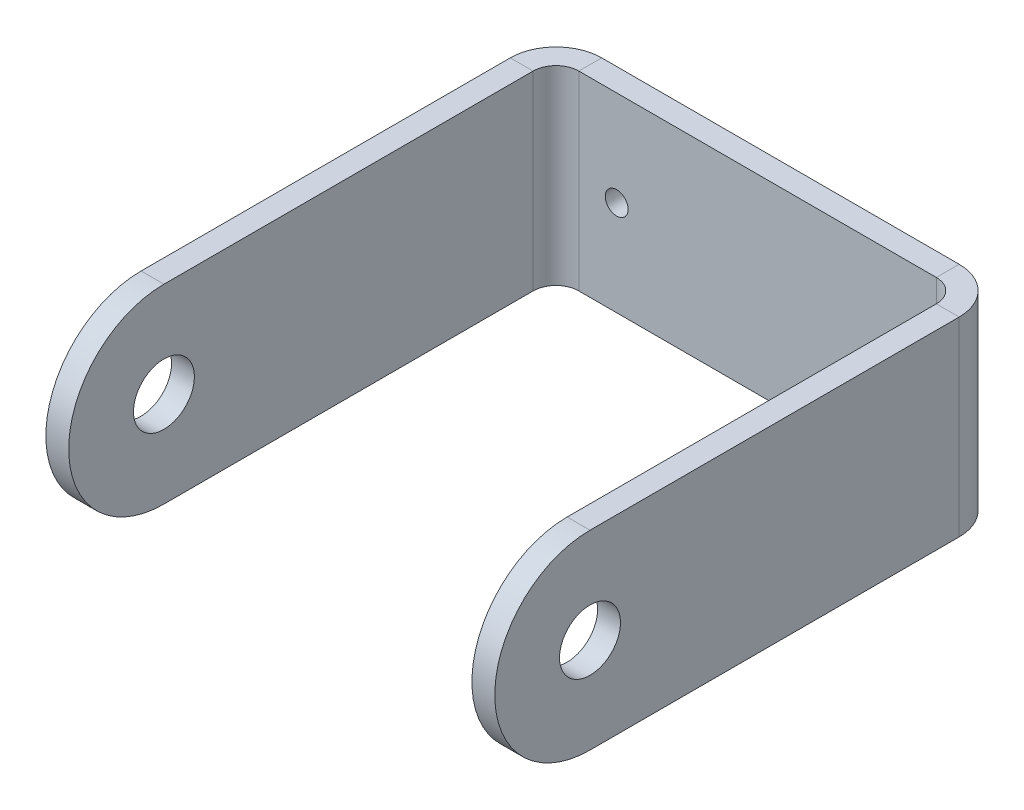
ISO-10303-21;
HEADER;
FILE_DESCRIPTION(('STEP AP214'),'2;1');
FILE_NAME('part.step','',(''),(''),'','','');
FILE_SCHEMA(('AUTOMOTIVE_DESIGN { 1 0 10303 214 1 1 1 1 }'));
ENDSEC;
DATA;
#1=APPLICATION_CONTEXT('core data for automotive mechanical design processes');
#2=APPLICATION_PROTOCOL_DEFINITION('international standard','automotive_design',2000,#1);
#3=PRODUCT_CONTEXT('',#1,'mechanical');
#4=PRODUCT('Part','Part','',(#3));
#5=PRODUCT_RELATED_PRODUCT_CATEGORY('part','',(#4));
#6=PRODUCT_DEFINITION_FORMATION('','',#4);
#7=PRODUCT_DEFINITION_CONTEXT('part definition',#1,'design');
#8=PRODUCT_DEFINITION('design','',#6,#7);
#9=PRODUCT_DEFINITION_SHAPE('','',#8);
#10=(LENGTH_UNIT() NAMED_UNIT(*) SI_UNIT(.MILLI.,.METRE.));
#11=(NAMED_UNIT(*) PLANE_ANGLE_UNIT() SI_UNIT($,.RADIAN.));
#12=(NAMED_UNIT(*) SI_UNIT($,.STERADIAN.) SOLID_ANGLE_UNIT());
#13=UNCERTAINTY_MEASURE_WITH_UNIT(LENGTH_MEASURE(1.E-05),#10,'distance_accuracy_value','');
#14=(GEOMETRIC_REPRESENTATION_CONTEXT(3) GLOBAL_UNCERTAINTY_ASSIGNED_CONTEXT((#13)) GLOBAL_UNIT_ASSIGNED_CONTEXT((#10,
#11,#12)) REPRESENTATION_CONTEXT('',''));
#15=CARTESIAN_POINT('',(0.,0.,0.));
#16=DIRECTION('',(0.,0.,1.));
#17=DIRECTION('',(1.,0.,0.));
#18=AXIS2_PLACEMENT_3D('',#15,#16,#17);
#19=CARTESIAN_POINT('',(79.,0.,3.));
#20=DIRECTION('',(0.,0.,-1.));
#21=DIRECTION('',(-1.,0.,0.));
#22=AXIS2_PLACEMENT_3D('',#19,#20,#21);
#23=PLANE('',#22);
#24=CARTESIAN_POINT('',(-18.5,0.,3.));
#25=DIRECTION('',(0.,0.,-1.));
#26=DIRECTION('',(1.,0.,0.));
#27=AXIS2_PLACEMENT_3D('',#24,#25,#26);
#28=CIRCLE('',#27,1.5);
#29=CARTESIAN_POINT('',(-17.,0.,3.));
#30=VERTEX_POINT('',#29);
#31=EDGE_CURVE('E637',#30,#30,#28,.T.);
#32=ORIENTED_EDGE('',*,*,#31,.T.);
#33=EDGE_LOOP('',(#32));
#34=FACE_BOUND('',#33,.T.);
#35=CARTESIAN_POINT('',(18.5,0.,3.));
#36=DIRECTION('',(0.,0.,-1.));
#37=DIRECTION('',(-1.,0.,0.));
#38=AXIS2_PLACEMENT_3D('',#35,#36,#37);
#39=CIRCLE('',#38,1.5);
#40=CARTESIAN_POINT('',(17.,0.,3.));
#41=VERTEX_POINT('',#40);
#42=EDGE_CURVE('E189',#41,#41,#39,.T.);
#43=ORIENTED_EDGE('',*,*,#42,.T.);
#44=EDGE_LOOP('',(#43));
#45=FACE_BOUND('',#44,.T.);
#46=DIRECTION('',(-1.,0.,0.));
#47=VECTOR('',#46,1.);
#48=CARTESIAN_POINT('',(-79.,12.5,3.));
#49=LINE('',#48,#47);
#50=CARTESIAN_POINT('',(23.4657082647115,12.5,3.));
#51=VERTEX_POINT('',#50);
#52=CARTESIAN_POINT('',(-23.4657082647115,12.5,3.));
#53=VERTEX_POINT('',#52);
#54=EDGE_CURVE('E49',#51,#53,#49,.T.);
#55=ORIENTED_EDGE('',*,*,#54,.T.);
#56=DIRECTION('',(0.,-1.,0.));
#57=VECTOR('',#56,1.);
#58=CARTESIAN_POINT('',(-23.4657082647115,-7.10998678437543E-13,3.));
#59=LINE('',#58,#57);
#60=CARTESIAN_POINT('',(-23.4657082647114,-12.5,3.));
#61=VERTEX_POINT('',#60);
#62=EDGE_CURVE('E259',#53,#61,#59,.T.);
#63=ORIENTED_EDGE('',*,*,#62,.T.);
#64=DIRECTION('',(1.,0.,0.));
#65=VECTOR('',#64,1.);
#66=CARTESIAN_POINT('',(-79.,-12.5,3.));
#67=LINE('',#66,#65);
#68=CARTESIAN_POINT('',(23.4657082647115,-12.5,3.));
#69=VERTEX_POINT('',#68);
#70=EDGE_CURVE('E252',#61,#69,#67,.T.);
#71=ORIENTED_EDGE('',*,*,#70,.T.);
#72=DIRECTION('',(0.,-1.,0.));
#73=VECTOR('',#72,1.);
#74=CARTESIAN_POINT('',(23.4657082647115,0.,3.));
#75=LINE('',#74,#73);
#76=EDGE_CURVE('E249',#51,#69,#75,.T.);
#77=ORIENTED_EDGE('',*,*,#76,.F.);
#78=EDGE_LOOP('',(#55,#63,#71,#77));
#79=FACE_BOUND('',#78,.T.);
#80=ADVANCED_FACE('F45',(#34,#45,#79),#23,.F.);
#81=CARTESIAN_POINT('',(-79.,-12.5,3.));
#82=DIRECTION('',(0.,1.,0.));
#83=DIRECTION('',(1.,0.,0.));
#84=AXIS2_PLACEMENT_3D('',#81,#82,#83);
#85=PLANE('',#84);
#86=DIRECTION('',(0.,0.,1.));
#87=VECTOR('',#86,1.);
#88=CARTESIAN_POINT('',(-23.4657082647114,-12.5,3.));
#89=LINE('',#88,#87);
#90=CARTESIAN_POINT('',(-23.4657082647115,-12.5,0.));
#91=VERTEX_POINT('',#90);
#92=EDGE_CURVE('E12',#91,#61,#89,.T.);
#93=ORIENTED_EDGE('',*,*,#92,.F.);
#94=DIRECTION('',(-1.,0.,0.));
#95=VECTOR('',#94,1.);
#96=CARTESIAN_POINT('',(79.,-12.5,0.));
#97=LINE('',#96,#95);
#98=CARTESIAN_POINT('',(23.4657082647115,-12.5,0.));
#99=VERTEX_POINT('',#98);
#100=EDGE_CURVE('E62',#91,#99,#97,.F.);
#101=ORIENTED_EDGE('',*,*,#100,.T.);
#102=DIRECTION('',(0.,0.,1.));
#103=VECTOR('',#102,1.);
#104=CARTESIAN_POINT('',(23.4657082647115,-12.5,3.));
#105=LINE('',#104,#103);
#106=EDGE_CURVE('E251',#99,#69,#105,.T.);
#107=ORIENTED_EDGE('',*,*,#106,.T.);
#108=ORIENTED_EDGE('',*,*,#70,.F.);
#109=EDGE_LOOP('',(#93,#101,#107,#108));
#110=FACE_BOUND('',#109,.T.);
#111=ADVANCED_FACE('F47',(#110),#85,.F.);
#112=CARTESIAN_POINT('',(-79.,12.5,3.));
#113=DIRECTION('',(0.,-1.,0.));
#114=DIRECTION('',(-1.,0.,0.));
#115=AXIS2_PLACEMENT_3D('',#112,#113,#114);
#116=PLANE('',#115);
#117=DIRECTION('',(0.,0.,-1.));
#118=VECTOR('',#117,1.);
#119=CARTESIAN_POINT('',(-23.4657082647116,12.5,3.));
#120=LINE('',#119,#118);
#121=CARTESIAN_POINT('',(-23.4657082647115,12.5,0.));
#122=VERTEX_POINT('',#121);
#123=EDGE_CURVE('E262',#53,#122,#120,.T.);
#124=ORIENTED_EDGE('',*,*,#123,.F.);
#125=ORIENTED_EDGE('',*,*,#54,.F.);
#126=DIRECTION('',(0.,0.,-1.));
#127=VECTOR('',#126,1.);
#128=CARTESIAN_POINT('',(23.4657082647115,12.5,3.));
#129=LINE('',#128,#127);
#130=CARTESIAN_POINT('',(23.4657082647115,12.5,0.));
#131=VERTEX_POINT('',#130);
#132=EDGE_CURVE('E257',#51,#131,#129,.T.);
#133=ORIENTED_EDGE('',*,*,#132,.T.);
#134=DIRECTION('',(-1.,0.,0.));
#135=VECTOR('',#134,1.);
#136=CARTESIAN_POINT('',(79.,12.5,0.));
#137=LINE('',#136,#135);
#138=EDGE_CURVE('E70',#131,#122,#137,.T.);
#139=ORIENTED_EDGE('',*,*,#138,.T.);
#140=EDGE_LOOP('',(#124,#125,#133,#139));
#141=FACE_BOUND('',#140,.T.);
#142=ADVANCED_FACE('F274',(#141),#116,.F.);
#143=CARTESIAN_POINT('',(79.,0.,0.));
#144=DIRECTION('',(0.,0.,-1.));
#145=DIRECTION('',(-1.,0.,0.));
#146=AXIS2_PLACEMENT_3D('',#143,#144,#145);
#147=PLANE('',#146);
#148=CARTESIAN_POINT('',(-18.5,0.,0.));
#149=DIRECTION('',(0.,0.,-1.));
#150=DIRECTION('',(1.,0.,0.));
#151=AXIS2_PLACEMENT_3D('',#148,#149,#150);
#152=CIRCLE('',#151,1.5);
#153=CARTESIAN_POINT('',(-17.,0.,0.));
#154=VERTEX_POINT('',#153);
#155=EDGE_CURVE('E350',#154,#154,#152,.T.);
#156=ORIENTED_EDGE('',*,*,#155,.F.);
#157=EDGE_LOOP('',(#156));
#158=FACE_BOUND('',#157,.T.);
#159=CARTESIAN_POINT('',(18.5,0.,0.));
#160=DIRECTION('',(0.,0.,-1.));
#161=DIRECTION('',(-1.,0.,0.));
#162=AXIS2_PLACEMENT_3D('',#159,#160,#161);
#163=CIRCLE('',#162,1.5);
#164=CARTESIAN_POINT('',(17.,0.,0.));
#165=VERTEX_POINT('',#164);
#166=EDGE_CURVE('E353',#165,#165,#163,.T.);
#167=ORIENTED_EDGE('',*,*,#166,.F.);
#168=EDGE_LOOP('',(#167));
#169=FACE_BOUND('',#168,.T.);
#170=DIRECTION('',(0.,-1.,0.));
#171=VECTOR('',#170,1.);
#172=CARTESIAN_POINT('',(-23.4657082647115,-7.10998678437543E-13,0.));
#173=LINE('',#172,#171);
#174=EDGE_CURVE('E54',#122,#91,#173,.T.);
#175=ORIENTED_EDGE('',*,*,#174,.F.);
#176=ORIENTED_EDGE('',*,*,#138,.F.);
#177=DIRECTION('',(0.,-1.,0.));
#178=VECTOR('',#177,1.);
#179=CARTESIAN_POINT('',(23.4657082647115,0.,0.));
#180=LINE('',#179,#178);
#181=EDGE_CURVE('E255',#131,#99,#180,.T.);
#182=ORIENTED_EDGE('',*,*,#181,.T.);
#183=ORIENTED_EDGE('',*,*,#100,.F.);
#184=EDGE_LOOP('',(#175,#176,#182,#183));
#185=FACE_BOUND('',#184,.T.);
#186=ADVANCED_FACE('F341',(#158,#169,#185),#147,.T.);
#187=CARTESIAN_POINT('',(23.4657082647115,12.5,6.));
#188=DIRECTION('',(0.,-1.,0.));
#189=DIRECTION('',(0.,0.,-1.));
#190=AXIS2_PLACEMENT_3D('',#187,#188,#189);
#191=PLANE('',#190);
#192=DIRECTION('',(1.,0.,0.));
#193=VECTOR('',#192,1.);
#194=CARTESIAN_POINT('',(26.4657082647115,12.5,6.00000000000001));
#195=LINE('',#194,#193);
#196=CARTESIAN_POINT('',(26.4657082647115,12.5,6.00000000000001));
#197=VERTEX_POINT('',#196);
#198=CARTESIAN_POINT('',(29.4657082647115,12.5,6.00000000000002));
#199=VERTEX_POINT('',#198);
#200=EDGE_CURVE('E197',#197,#199,#195,.T.);
#201=ORIENTED_EDGE('',*,*,#200,.T.);
#202=CARTESIAN_POINT('',(23.4657082647115,12.5,6.));
#203=DIRECTION('',(0.,1.,0.));
#204=DIRECTION('',(-1.,0.,0.));
#205=AXIS2_PLACEMENT_3D('',#202,#203,#204);
#206=CIRCLE('',#205,6.);
#207=EDGE_CURVE('E204',#199,#131,#206,.T.);
#208=ORIENTED_EDGE('',*,*,#207,.T.);
#209=ORIENTED_EDGE('',*,*,#132,.F.);
#210=CARTESIAN_POINT('',(23.4657082647115,12.5,6.));
#211=DIRECTION('',(0.,1.,0.));
#212=DIRECTION('',(0.,0.,1.));
#213=AXIS2_PLACEMENT_3D('',#210,#211,#212);
#214=CIRCLE('',#213,3.);
#215=EDGE_CURVE('E239',#197,#51,#214,.T.);
#216=ORIENTED_EDGE('',*,*,#215,.F.);
#217=EDGE_LOOP('',(#201,#208,#209,#216));
#218=FACE_BOUND('',#217,.T.);
#219=ADVANCED_FACE('F304',(#218),#191,.F.);
#220=CARTESIAN_POINT('',(23.4657082647115,-12.5,6.));
#221=DIRECTION('',(0.,1.,0.));
#222=DIRECTION('',(0.,0.,1.));
#223=AXIS2_PLACEMENT_3D('',#220,#221,#222);
#224=PLANE('',#223);
#225=ORIENTED_EDGE('',*,*,#106,.F.);
#226=CARTESIAN_POINT('',(23.4657082647115,-12.5,6.));
#227=DIRECTION('',(0.,1.,0.));
#228=DIRECTION('',(-1.,0.,0.));
#229=AXIS2_PLACEMENT_3D('',#226,#227,#228);
#230=CIRCLE('',#229,6.);
#231=CARTESIAN_POINT('',(29.4657082647115,-12.5,6.00000000000002));
#232=VERTEX_POINT('',#231);
#233=EDGE_CURVE('E243',#99,#232,#230,.F.);
#234=ORIENTED_EDGE('',*,*,#233,.T.);
#235=DIRECTION('',(-1.,0.,0.));
#236=VECTOR('',#235,1.);
#237=CARTESIAN_POINT('',(26.4657082647115,-12.5,6.00000000000001));
#238=LINE('',#237,#236);
#239=CARTESIAN_POINT('',(26.4657082647115,-12.5,6.));
#240=VERTEX_POINT('',#239);
#241=EDGE_CURVE('E231',#232,#240,#238,.T.);
#242=ORIENTED_EDGE('',*,*,#241,.T.);
#243=CARTESIAN_POINT('',(23.4657082647115,-12.5,6.));
#244=DIRECTION('',(0.,-1.,0.));
#245=DIRECTION('',(0.,0.,-1.));
#246=AXIS2_PLACEMENT_3D('',#243,#244,#245);
#247=CIRCLE('',#246,3.);
#248=EDGE_CURVE('E242',#69,#240,#247,.T.);
#249=ORIENTED_EDGE('',*,*,#248,.F.);
#250=EDGE_LOOP('',(#225,#234,#242,#249));
#251=FACE_BOUND('',#250,.T.);
#252=ADVANCED_FACE('F289',(#251),#224,.F.);
#253=CARTESIAN_POINT('',(23.4657082647115,-26.1527220816594,6.));
#254=DIRECTION('',(0.,1.,0.));
#255=DIRECTION('',(-1.,0.,0.));
#256=AXIS2_PLACEMENT_3D('',#253,#254,#255);
#257=CYLINDRICAL_SURFACE('',#256,3.);
#258=ORIENTED_EDGE('',*,*,#248,.T.);
#259=DIRECTION('',(0.,-1.,0.));
#260=VECTOR('',#259,1.);
#261=CARTESIAN_POINT('',(26.4657082647115,0.,6.00000000000001));
#262=LINE('',#261,#260);
#263=EDGE_CURVE('E218',#197,#240,#262,.T.);
#264=ORIENTED_EDGE('',*,*,#263,.F.);
#265=ORIENTED_EDGE('',*,*,#215,.T.);
#266=ORIENTED_EDGE('',*,*,#76,.T.);
#267=EDGE_LOOP('',(#258,#264,#265,#266));
#268=FACE_BOUND('',#267,.T.);
#269=ADVANCED_FACE('F318',(#268),#257,.F.);
#270=CARTESIAN_POINT('',(23.4657082647115,-26.1527220816594,6.));
#271=DIRECTION('',(0.,1.,0.));
#272=DIRECTION('',(-1.,0.,0.));
#273=AXIS2_PLACEMENT_3D('',#270,#271,#272);
#274=CYLINDRICAL_SURFACE('',#273,6.);
#275=ORIENTED_EDGE('',*,*,#233,.F.);
#276=ORIENTED_EDGE('',*,*,#181,.F.);
#277=ORIENTED_EDGE('',*,*,#207,.F.);
#278=DIRECTION('',(0.,-1.,0.));
#279=VECTOR('',#278,1.);
#280=CARTESIAN_POINT('',(29.4657082647115,0.,6.00000000000002));
#281=LINE('',#280,#279);
#282=EDGE_CURVE('E234',#199,#232,#281,.T.);
#283=ORIENTED_EDGE('',*,*,#282,.T.);
#284=EDGE_LOOP('',(#275,#276,#277,#283));
#285=FACE_BOUND('',#284,.T.);
#286=ADVANCED_FACE('F292',(#285),#274,.T.);
#287=CARTESIAN_POINT('',(26.4657082647113,0.,54.4657082647115));
#288=DIRECTION('',(-1.,0.,0.));
#289=DIRECTION('',(0.,0.,1.));
#290=AXIS2_PLACEMENT_3D('',#287,#288,#289);
#291=CYLINDRICAL_SURFACE('',#290,12.5);
#292=DIRECTION('',(-1.,0.,0.));
#293=VECTOR('',#292,1.);
#294=CARTESIAN_POINT('',(26.4657082647113,-12.5,54.4657082647115));
#295=LINE('',#294,#293);
#296=CARTESIAN_POINT('',(29.4657082647113,-12.5,54.4657082647115));
#297=VERTEX_POINT('',#296);
#298=CARTESIAN_POINT('',(26.4657082647113,-12.5,54.4657082647115));
#299=VERTEX_POINT('',#298);
#300=EDGE_CURVE('E208',#297,#299,#295,.T.);
#301=ORIENTED_EDGE('',*,*,#300,.F.);
#302=CARTESIAN_POINT('',(29.4657082647113,0.,54.4657082647115));
#303=DIRECTION('',(-1.,0.,0.));
#304=DIRECTION('',(0.,0.,1.));
#305=AXIS2_PLACEMENT_3D('',#302,#303,#304);
#306=CIRCLE('',#305,12.5);
#307=CARTESIAN_POINT('',(29.4657082647113,12.5,54.4657082647115));
#308=VERTEX_POINT('',#307);
#309=EDGE_CURVE('E228',#297,#308,#306,.T.);
#310=ORIENTED_EDGE('',*,*,#309,.T.);
#311=DIRECTION('',(-1.,0.,0.));
#312=VECTOR('',#311,1.);
#313=CARTESIAN_POINT('',(26.4657082647113,12.5,54.4657082647115));
#314=LINE('',#313,#312);
#315=CARTESIAN_POINT('',(26.4657082647113,12.5,54.4657082647115));
#316=VERTEX_POINT('',#315);
#317=EDGE_CURVE('E226',#308,#316,#314,.T.);
#318=ORIENTED_EDGE('',*,*,#317,.T.);
#319=CARTESIAN_POINT('',(26.4657082647113,0.,54.4657082647115));
#320=DIRECTION('',(-1.,0.,0.));
#321=DIRECTION('',(0.,0.,-1.));
#322=AXIS2_PLACEMENT_3D('',#319,#320,#321);
#323=CIRCLE('',#322,12.5);
#324=EDGE_CURVE('E213',#299,#316,#323,.T.);
#325=ORIENTED_EDGE('',*,*,#324,.F.);
#326=EDGE_LOOP('',(#301,#310,#318,#325));
#327=FACE_BOUND('',#326,.T.);
#328=ADVANCED_FACE('F312',(#327),#291,.T.);
#329=CARTESIAN_POINT('',(26.4657082647113,0.,54.4657082647115));
#330=DIRECTION('',(-1.,0.,0.));
#331=DIRECTION('',(0.,0.,1.));
#332=AXIS2_PLACEMENT_3D('',#329,#330,#331);
#333=CYLINDRICAL_SURFACE('',#332,4.00000000000001);
#334=CARTESIAN_POINT('',(26.4657082647113,0.,54.4657082647115));
#335=DIRECTION('',(-1.,0.,0.));
#336=DIRECTION('',(0.,0.,-1.));
#337=AXIS2_PLACEMENT_3D('',#334,#335,#336);
#338=CIRCLE('',#337,4.00000000000001);
#339=CARTESIAN_POINT('',(26.4657082647113,0.,50.4657082647115));
#340=VERTEX_POINT('',#339);
#341=EDGE_CURVE('E223',#340,#340,#338,.T.);
#342=ORIENTED_EDGE('',*,*,#341,.T.);
#343=EDGE_LOOP('',(#342));
#344=FACE_BOUND('',#343,.T.);
#345=CARTESIAN_POINT('',(29.4657082647113,0.,54.4657082647115));
#346=DIRECTION('',(-1.,0.,0.));
#347=DIRECTION('',(0.,0.,1.));
#348=AXIS2_PLACEMENT_3D('',#345,#346,#347);
#349=CIRCLE('',#348,4.00000000000001);
#350=CARTESIAN_POINT('',(29.4657082647113,0.,58.4657082647115));
#351=VERTEX_POINT('',#350);
#352=EDGE_CURVE('E205',#351,#351,#349,.T.);
#353=ORIENTED_EDGE('',*,*,#352,.F.);
#354=EDGE_LOOP('',(#353));
#355=FACE_BOUND('',#354,.T.);
#356=ADVANCED_FACE('F374',(#344,#355),#333,.F.);
#357=CARTESIAN_POINT('',(26.4657082647113,0.,54.4657082647115));
#358=DIRECTION('',(1.,0.,0.));
#359=DIRECTION('',(0.,0.,-1.));
#360=AXIS2_PLACEMENT_3D('',#357,#358,#359);
#361=PLANE('',#360);
#362=ORIENTED_EDGE('',*,*,#341,.F.);
#363=EDGE_LOOP('',(#362));
#364=FACE_BOUND('',#363,.T.);
#365=DIRECTION('',(0.,0.,-1.));
#366=VECTOR('',#365,1.);
#367=CARTESIAN_POINT('',(26.4657082647119,12.5,-103.534291735289));
#368=LINE('',#367,#366);
#369=EDGE_CURVE('E221',#316,#197,#368,.T.);
#370=ORIENTED_EDGE('',*,*,#369,.T.);
#371=ORIENTED_EDGE('',*,*,#263,.T.);
#372=DIRECTION('',(0.,0.,1.));
#373=VECTOR('',#372,1.);
#374=CARTESIAN_POINT('',(26.4657082647119,-12.5,-103.534291735289));
#375=LINE('',#374,#373);
#376=EDGE_CURVE('E216',#240,#299,#375,.T.);
#377=ORIENTED_EDGE('',*,*,#376,.T.);
#378=ORIENTED_EDGE('',*,*,#324,.T.);
#379=EDGE_LOOP('',(#370,#371,#377,#378));
#380=FACE_BOUND('',#379,.T.);
#381=ADVANCED_FACE('F314',(#364,#380),#361,.F.);
#382=CARTESIAN_POINT('',(26.4657082647119,-12.5,-103.534291735289));
#383=DIRECTION('',(0.,1.,0.));
#384=DIRECTION('',(0.,0.,1.));
#385=AXIS2_PLACEMENT_3D('',#382,#383,#384);
#386=PLANE('',#385);
#387=ORIENTED_EDGE('',*,*,#241,.F.);
#388=DIRECTION('',(0.,0.,-1.));
#389=VECTOR('',#388,1.);
#390=CARTESIAN_POINT('',(29.4657082647113,-12.5,54.4657082647115));
#391=LINE('',#390,#389);
#392=EDGE_CURVE('E211',#232,#297,#391,.F.);
#393=ORIENTED_EDGE('',*,*,#392,.T.);
#394=ORIENTED_EDGE('',*,*,#300,.T.);
#395=ORIENTED_EDGE('',*,*,#376,.F.);
#396=EDGE_LOOP('',(#387,#393,#394,#395));
#397=FACE_BOUND('',#396,.T.);
#398=ADVANCED_FACE('F316',(#397),#386,.F.);
#399=CARTESIAN_POINT('',(29.4657082647113,0.,54.4657082647115));
#400=DIRECTION('',(1.,0.,0.));
#401=DIRECTION('',(0.,0.,-1.));
#402=AXIS2_PLACEMENT_3D('',#399,#400,#401);
#403=PLANE('',#402);
#404=ORIENTED_EDGE('',*,*,#282,.F.);
#405=DIRECTION('',(0.,0.,-1.));
#406=VECTOR('',#405,1.);
#407=CARTESIAN_POINT('',(29.4657082647113,12.5,54.4657082647115));
#408=LINE('',#407,#406);
#409=EDGE_CURVE('E202',#308,#199,#408,.T.);
#410=ORIENTED_EDGE('',*,*,#409,.F.);
#411=ORIENTED_EDGE('',*,*,#309,.F.);
#412=ORIENTED_EDGE('',*,*,#392,.F.);
#413=EDGE_LOOP('',(#404,#410,#411,#412));
#414=FACE_BOUND('',#413,.T.);
#415=ORIENTED_EDGE('',*,*,#352,.T.);
#416=EDGE_LOOP('',(#415));
#417=FACE_BOUND('',#416,.T.);
#418=ADVANCED_FACE('F297',(#414,#417),#403,.T.);
#419=CARTESIAN_POINT('',(26.4657082647119,12.5,-103.534291735289));
#420=DIRECTION('',(0.,-1.,0.));
#421=DIRECTION('',(0.,0.,-1.));
#422=AXIS2_PLACEMENT_3D('',#419,#420,#421);
#423=PLANE('',#422);
#424=ORIENTED_EDGE('',*,*,#200,.F.);
#425=ORIENTED_EDGE('',*,*,#369,.F.);
#426=ORIENTED_EDGE('',*,*,#317,.F.);
#427=ORIENTED_EDGE('',*,*,#409,.T.);
#428=EDGE_LOOP('',(#424,#425,#426,#427));
#429=FACE_BOUND('',#428,.T.);
#430=ADVANCED_FACE('F308',(#429),#423,.F.);
#431=CARTESIAN_POINT('',(-23.4657082647116,12.5,6.));
#432=DIRECTION('',(0.,-1.,0.));
#433=DIRECTION('',(1.,0.,0.));
#434=AXIS2_PLACEMENT_3D('',#431,#432,#433);
#435=PLANE('',#434);
#436=ORIENTED_EDGE('',*,*,#123,.T.);
#437=CARTESIAN_POINT('',(-23.4657082647116,12.5,6.));
#438=DIRECTION('',(0.,-1.,0.));
#439=DIRECTION('',(1.,0.,0.));
#440=AXIS2_PLACEMENT_3D('',#437,#438,#439);
#441=CIRCLE('',#440,6.);
#442=CARTESIAN_POINT('',(-29.4657082647116,12.5,5.99999999999993));
#443=VERTEX_POINT('',#442);
#444=EDGE_CURVE('E166',#122,#443,#441,.F.);
#445=ORIENTED_EDGE('',*,*,#444,.T.);
#446=DIRECTION('',(-1.,0.,0.));
#447=VECTOR('',#446,1.);
#448=CARTESIAN_POINT('',(-26.4657082647117,12.5,5.99999999999993));
#449=LINE('',#448,#447);
#450=CARTESIAN_POINT('',(-26.4657082647117,12.5,5.99999999999984));
#451=VERTEX_POINT('',#450);
#452=EDGE_CURVE('E177',#451,#443,#449,.T.);
#453=ORIENTED_EDGE('',*,*,#452,.F.);
#454=CARTESIAN_POINT('',(-23.4657082647116,12.5,6.));
#455=DIRECTION('',(0.,1.,0.));
#456=DIRECTION('',(-1.,0.,0.));
#457=AXIS2_PLACEMENT_3D('',#454,#455,#456);
#458=CIRCLE('',#457,3.);
#459=EDGE_CURVE('E190',#53,#451,#458,.T.);
#460=ORIENTED_EDGE('',*,*,#459,.F.);
#461=EDGE_LOOP('',(#436,#445,#453,#460));
#462=FACE_BOUND('',#461,.T.);
#463=ADVANCED_FACE('F278',(#462),#435,.F.);
#464=CARTESIAN_POINT('',(-23.4657082647114,-12.5,6.));
#465=DIRECTION('',(0.,1.,0.));
#466=DIRECTION('',(0.,0.,1.));
#467=AXIS2_PLACEMENT_3D('',#464,#465,#466);
#468=PLANE('',#467);
#469=DIRECTION('',(1.,0.,0.));
#470=VECTOR('',#469,1.);
#471=CARTESIAN_POINT('',(-26.4657082647115,-12.5,5.99999999999993));
#472=LINE('',#471,#470);
#473=CARTESIAN_POINT('',(-29.4657082647115,-12.5,5.99999999999994));
#474=VERTEX_POINT('',#473);
#475=CARTESIAN_POINT('',(-26.4657082647114,-12.5,6.));
#476=VERTEX_POINT('',#475);
#477=EDGE_CURVE('E164',#474,#476,#472,.T.);
#478=ORIENTED_EDGE('',*,*,#477,.F.);
#479=CARTESIAN_POINT('',(-23.4657082647114,-12.5,6.));
#480=DIRECTION('',(0.,-1.,0.));
#481=DIRECTION('',(1.,0.,0.));
#482=AXIS2_PLACEMENT_3D('',#479,#480,#481);
#483=CIRCLE('',#482,6.);
#484=EDGE_CURVE('E194',#474,#91,#483,.T.);
#485=ORIENTED_EDGE('',*,*,#484,.T.);
#486=ORIENTED_EDGE('',*,*,#92,.T.);
#487=CARTESIAN_POINT('',(-23.4657082647114,-12.5,6.));
#488=DIRECTION('',(0.,-1.,0.));
#489=DIRECTION('',(0.,0.,-1.));
#490=AXIS2_PLACEMENT_3D('',#487,#488,#489);
#491=CIRCLE('',#490,3.);
#492=EDGE_CURVE('E193',#476,#61,#491,.T.);
#493=ORIENTED_EDGE('',*,*,#492,.F.);
#494=EDGE_LOOP('',(#478,#485,#486,#493));
#495=FACE_BOUND('',#494,.T.);
#496=ADVANCED_FACE('F283',(#495),#468,.F.);
#497=CARTESIAN_POINT('',(-23.4657082647117,26.1527220816594,6.));
#498=DIRECTION('',(0.,-1.,0.));
#499=DIRECTION('',(1.,0.,0.));
#500=AXIS2_PLACEMENT_3D('',#497,#498,#499);
#501=CYLINDRICAL_SURFACE('',#500,3.);
#502=ORIENTED_EDGE('',*,*,#492,.T.);
#503=ORIENTED_EDGE('',*,*,#62,.F.);
#504=ORIENTED_EDGE('',*,*,#459,.T.);
#505=DIRECTION('',(0.,-1.,0.));
#506=VECTOR('',#505,1.);
#507=CARTESIAN_POINT('',(-26.4657082647116,-7.32053306862212E-13,5.99999999999993));
#508=LINE('',#507,#506);
#509=EDGE_CURVE('E186',#451,#476,#508,.T.);
#510=ORIENTED_EDGE('',*,*,#509,.T.);
#511=EDGE_LOOP('',(#502,#503,#504,#510));
#512=FACE_BOUND('',#511,.T.);
#513=ADVANCED_FACE('F280',(#512),#501,.F.);
#514=CARTESIAN_POINT('',(-23.4657082647117,26.1527220816594,6.));
#515=DIRECTION('',(0.,-1.,0.));
#516=DIRECTION('',(1.,0.,0.));
#517=AXIS2_PLACEMENT_3D('',#514,#515,#516);
#518=CYLINDRICAL_SURFACE('',#517,6.);
#519=ORIENTED_EDGE('',*,*,#484,.F.);
#520=DIRECTION('',(0.,-1.,0.));
#521=VECTOR('',#520,1.);
#522=CARTESIAN_POINT('',(-29.4657082647116,-7.52869988573934E-13,5.99999999999994));
#523=LINE('',#522,#521);
#524=EDGE_CURVE('E162',#443,#474,#523,.T.);
#525=ORIENTED_EDGE('',*,*,#524,.F.);
#526=ORIENTED_EDGE('',*,*,#444,.F.);
#527=ORIENTED_EDGE('',*,*,#174,.T.);
#528=EDGE_LOOP('',(#519,#525,#526,#527));
#529=FACE_BOUND('',#528,.T.);
#530=ADVANCED_FACE('F355',(#529),#518,.T.);
#531=CARTESIAN_POINT('',(-26.4657082647114,3.64291929955131E-13,54.4657082647114));
#532=DIRECTION('',(1.,0.,0.));
#533=DIRECTION('',(0.,0.,-1.));
#534=AXIS2_PLACEMENT_3D('',#531,#532,#533);
#535=CYLINDRICAL_SURFACE('',#534,4.00000000000001);
#536=CARTESIAN_POINT('',(-26.4657082647114,3.64291929955131E-13,54.4657082647114));
#537=DIRECTION('',(1.,0.,0.));
#538=DIRECTION('',(0.,0.,-1.));
#539=AXIS2_PLACEMENT_3D('',#536,#537,#538);
#540=CIRCLE('',#539,4.00000000000001);
#541=CARTESIAN_POINT('',(-26.4657082647114,3.36536354339502E-13,50.4657082647114));
#542=VERTEX_POINT('',#541);
#543=EDGE_CURVE('E158',#542,#542,#540,.T.);
#544=ORIENTED_EDGE('',*,*,#543,.T.);
#545=EDGE_LOOP('',(#544));
#546=FACE_BOUND('',#545,.T.);
#547=CARTESIAN_POINT('',(-29.4657082647114,3.4347524824341E-13,54.4657082647114));
#548=DIRECTION('',(1.,0.,0.));
#549=DIRECTION('',(0.,0.,-1.));
#550=AXIS2_PLACEMENT_3D('',#547,#548,#549);
#551=CIRCLE('',#550,4.00000000000001);
#552=CARTESIAN_POINT('',(-29.4657082647114,3.15719672627781E-13,50.4657082647114));
#553=VERTEX_POINT('',#552);
#554=EDGE_CURVE('E168',#553,#553,#551,.T.);
#555=ORIENTED_EDGE('',*,*,#554,.F.);
#556=EDGE_LOOP('',(#555));
#557=FACE_BOUND('',#556,.T.);
#558=ADVANCED_FACE('F357',(#546,#557),#535,.F.);
#559=CARTESIAN_POINT('',(-26.4657082647114,3.64291929955131E-13,54.4657082647114));
#560=DIRECTION('',(1.,0.,0.));
#561=DIRECTION('',(0.,0.,-1.));
#562=AXIS2_PLACEMENT_3D('',#559,#560,#561);
#563=CYLINDRICAL_SURFACE('',#562,12.5);
#564=DIRECTION('',(1.,0.,0.));
#565=VECTOR('',#564,1.);
#566=CARTESIAN_POINT('',(-26.4657082647115,12.5000000000004,54.4657082647113));
#567=LINE('',#566,#565);
#568=CARTESIAN_POINT('',(-29.4657082647115,12.5000000000003,54.4657082647113));
#569=VERTEX_POINT('',#568);
#570=CARTESIAN_POINT('',(-26.4657082647115,12.5000000000004,54.4657082647113));
#571=VERTEX_POINT('',#570);
#572=EDGE_CURVE('E156',#569,#571,#567,.T.);
#573=ORIENTED_EDGE('',*,*,#572,.F.);
#574=CARTESIAN_POINT('',(-29.4657082647114,3.4347524824341E-13,54.4657082647114));
#575=DIRECTION('',(1.,0.,0.));
#576=DIRECTION('',(0.,0.,-1.));
#577=AXIS2_PLACEMENT_3D('',#574,#575,#576);
#578=CIRCLE('',#577,12.5);
#579=CARTESIAN_POINT('',(-29.4657082647113,-12.4999999999997,54.4657082647115));
#580=VERTEX_POINT('',#579);
#581=EDGE_CURVE('E150',#569,#580,#578,.T.);
#582=ORIENTED_EDGE('',*,*,#581,.T.);
#583=DIRECTION('',(1.,0.,0.));
#584=VECTOR('',#583,1.);
#585=CARTESIAN_POINT('',(-26.4657082647113,-12.4999999999996,54.4657082647115));
#586=LINE('',#585,#584);
#587=CARTESIAN_POINT('',(-26.4657082647113,-12.4999999999996,54.4657082647115));
#588=VERTEX_POINT('',#587);
#589=EDGE_CURVE('E138',#580,#588,#586,.T.);
#590=ORIENTED_EDGE('',*,*,#589,.T.);
#591=CARTESIAN_POINT('',(-26.4657082647114,3.64291929955131E-13,54.4657082647114));
#592=DIRECTION('',(1.,0.,0.));
#593=DIRECTION('',(0.,0.,-1.));
#594=AXIS2_PLACEMENT_3D('',#591,#592,#593);
#595=CIRCLE('',#594,12.5);
#596=EDGE_CURVE('E181',#571,#588,#595,.T.);
#597=ORIENTED_EDGE('',*,*,#596,.F.);
#598=EDGE_LOOP('',(#573,#582,#590,#597));
#599=FACE_BOUND('',#598,.T.);
#600=ADVANCED_FACE('F154',(#599),#563,.T.);
#601=CARTESIAN_POINT('',(-26.4657082647119,-7.32053306862215E-13,-103.534291735289));
#602=DIRECTION('',(-1.,0.,0.));
#603=DIRECTION('',(0.,0.,1.));
#604=AXIS2_PLACEMENT_3D('',#601,#602,#603);
#605=PLANE('',#604);
#606=ORIENTED_EDGE('',*,*,#509,.F.);
#607=DIRECTION('',(0.,0.,1.));
#608=VECTOR('',#607,1.);
#609=CARTESIAN_POINT('',(-26.4657082647115,12.5000000000004,54.4657082647113));
#610=LINE('',#609,#608);
#611=EDGE_CURVE('E149',#451,#571,#610,.T.);
#612=ORIENTED_EDGE('',*,*,#611,.T.);
#613=ORIENTED_EDGE('',*,*,#596,.T.);
#614=DIRECTION('',(0.,0.,-1.));
#615=VECTOR('',#614,1.);
#616=CARTESIAN_POINT('',(-26.4657082647113,-12.4999999999996,54.4657082647115));
#617=LINE('',#616,#615);
#618=EDGE_CURVE('E145',#588,#476,#617,.T.);
#619=ORIENTED_EDGE('',*,*,#618,.T.);
#620=EDGE_LOOP('',(#606,#612,#613,#619));
#621=FACE_BOUND('',#620,.T.);
#622=ORIENTED_EDGE('',*,*,#543,.F.);
#623=EDGE_LOOP('',(#622));
#624=FACE_BOUND('',#623,.T.);
#625=ADVANCED_FACE('F425',(#621,#624),#605,.F.);
#626=CARTESIAN_POINT('',(-26.4657082647115,12.5000000000004,54.4657082647113));
#627=DIRECTION('',(0.,-1.,0.));
#628=DIRECTION('',(0.,0.,1.));
#629=AXIS2_PLACEMENT_3D('',#626,#627,#628);
#630=PLANE('',#629);
#631=ORIENTED_EDGE('',*,*,#611,.F.);
#632=ORIENTED_EDGE('',*,*,#452,.T.);
#633=DIRECTION('',(0.,0.,1.));
#634=VECTOR('',#633,1.);
#635=CARTESIAN_POINT('',(-29.465708264712,12.4999999999992,-103.534291735289));
#636=LINE('',#635,#634);
#637=EDGE_CURVE('E175',#443,#569,#636,.T.);
#638=ORIENTED_EDGE('',*,*,#637,.T.);
#639=ORIENTED_EDGE('',*,*,#572,.T.);
#640=EDGE_LOOP('',(#631,#632,#638,#639));
#641=FACE_BOUND('',#640,.T.);
#642=ADVANCED_FACE('F434',(#641),#630,.F.);
#643=CARTESIAN_POINT('',(-29.4657082647119,-7.52869988573936E-13,-103.534291735289));
#644=DIRECTION('',(-1.,0.,0.));
#645=DIRECTION('',(0.,0.,1.));
#646=AXIS2_PLACEMENT_3D('',#643,#644,#645);
#647=PLANE('',#646);
#648=ORIENTED_EDGE('',*,*,#554,.T.);
#649=EDGE_LOOP('',(#648));
#650=FACE_BOUND('',#649,.T.);
#651=ORIENTED_EDGE('',*,*,#637,.F.);
#652=ORIENTED_EDGE('',*,*,#524,.T.);
#653=DIRECTION('',(0.,0.,1.));
#654=VECTOR('',#653,1.);
#655=CARTESIAN_POINT('',(-29.4657082647119,-12.5000000000008,-103.534291735289));
#656=LINE('',#655,#654);
#657=EDGE_CURVE('E142',#580,#474,#656,.F.);
#658=ORIENTED_EDGE('',*,*,#657,.F.);
#659=ORIENTED_EDGE('',*,*,#581,.F.);
#660=EDGE_LOOP('',(#651,#652,#658,#659));
#661=FACE_BOUND('',#660,.T.);
#662=ADVANCED_FACE('F160',(#650,#661),#647,.T.);
#663=CARTESIAN_POINT('',(-26.4657082647113,-12.4999999999996,54.4657082647115));
#664=DIRECTION('',(0.,1.,0.));
#665=DIRECTION('',(0.,0.,-1.));
#666=AXIS2_PLACEMENT_3D('',#663,#664,#665);
#667=PLANE('',#666);
#668=ORIENTED_EDGE('',*,*,#657,.T.);
#669=ORIENTED_EDGE('',*,*,#477,.T.);
#670=ORIENTED_EDGE('',*,*,#618,.F.);
#671=ORIENTED_EDGE('',*,*,#589,.F.);
#672=EDGE_LOOP('',(#668,#669,#670,#671));
#673=FACE_BOUND('',#672,.T.);
#674=ADVANCED_FACE('F140',(#673),#667,.F.);
#675=CARTESIAN_POINT('',(18.5,0.,3.));
#676=DIRECTION('',(0.,0.,-1.));
#677=DIRECTION('',(-1.,0.,0.));
#678=AXIS2_PLACEMENT_3D('',#675,#676,#677);
#679=CYLINDRICAL_SURFACE('',#678,1.5);
#680=ORIENTED_EDGE('',*,*,#42,.F.);
#681=EDGE_LOOP('',(#680));
#682=FACE_BOUND('',#681,.T.);
#683=ORIENTED_EDGE('',*,*,#166,.T.);
#684=EDGE_LOOP('',(#683));
#685=FACE_BOUND('',#684,.T.);
#686=ADVANCED_FACE('F464',(#682,#685),#679,.F.);
#687=CARTESIAN_POINT('',(-18.5,0.,3.));
#688=DIRECTION('',(0.,0.,-1.));
#689=DIRECTION('',(-1.,0.,0.));
#690=AXIS2_PLACEMENT_3D('',#687,#688,#689);
#691=CYLINDRICAL_SURFACE('',#690,1.5);
#692=ORIENTED_EDGE('',*,*,#31,.F.);
#693=EDGE_LOOP('',(#692));
#694=FACE_BOUND('',#693,.T.);
#695=ORIENTED_EDGE('',*,*,#155,.T.);
#696=EDGE_LOOP('',(#695));
#697=FACE_BOUND('',#696,.T.);
#698=ADVANCED_FACE('F472',(#694,#697),#691,.F.);
#699=CLOSED_SHELL('',(#80,#111,#142,#186,#219,#252,#269,#286,#328,#356,#381,#398,#418,#430,#463,
#496,#513,#530,#558,#600,#625,#642,#662,#674,#686,#698));
#700=MANIFOLD_SOLID_BREP('B2',#699);
#701=ADVANCED_BREP_SHAPE_REPRESENTATION('',(#18,#700),#14);
#702=SHAPE_DEFINITION_REPRESENTATION(#9,#701);
ENDSEC;
END-ISO-10303-21;
